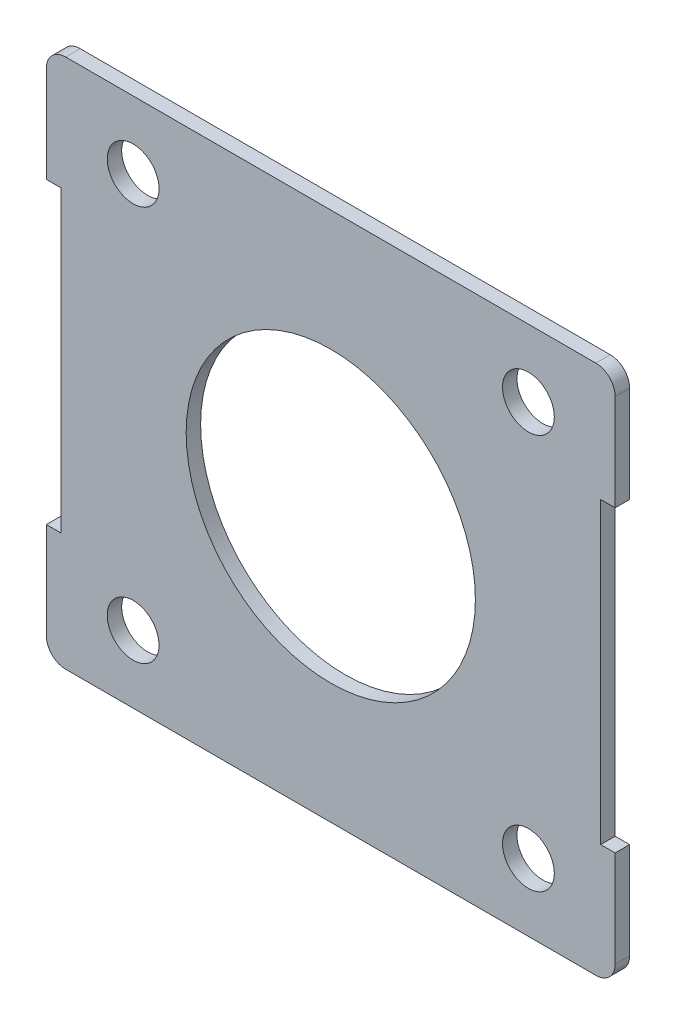
ISO-10303-21;
HEADER;
FILE_DESCRIPTION(('STEP AP214'),'2;1');
FILE_NAME('part.step','',(''),(''),'','','');
FILE_SCHEMA(('AUTOMOTIVE_DESIGN { 1 0 10303 214 1 1 1 1 }'));
ENDSEC;
DATA;
#1=APPLICATION_CONTEXT('core data for automotive mechanical design processes');
#2=APPLICATION_PROTOCOL_DEFINITION('international standard','automotive_design',2000,#1);
#3=PRODUCT_CONTEXT('',#1,'mechanical');
#4=PRODUCT('Part','Part','',(#3));
#5=PRODUCT_RELATED_PRODUCT_CATEGORY('part','',(#4));
#6=PRODUCT_DEFINITION_FORMATION('','',#4);
#7=PRODUCT_DEFINITION_CONTEXT('part definition',#1,'design');
#8=PRODUCT_DEFINITION('design','',#6,#7);
#9=PRODUCT_DEFINITION_SHAPE('','',#8);
#10=(LENGTH_UNIT() NAMED_UNIT(*) SI_UNIT(.MILLI.,.METRE.));
#11=(NAMED_UNIT(*) PLANE_ANGLE_UNIT() SI_UNIT($,.RADIAN.));
#12=(NAMED_UNIT(*) SI_UNIT($,.STERADIAN.) SOLID_ANGLE_UNIT());
#13=UNCERTAINTY_MEASURE_WITH_UNIT(LENGTH_MEASURE(1.E-05),#10,'distance_accuracy_value','');
#14=(GEOMETRIC_REPRESENTATION_CONTEXT(3) GLOBAL_UNCERTAINTY_ASSIGNED_CONTEXT((#13)) GLOBAL_UNIT_ASSIGNED_CONTEXT((#10,
#11,#12)) REPRESENTATION_CONTEXT('',''));
#15=CARTESIAN_POINT('',(0.,0.,0.));
#16=DIRECTION('',(0.,0.,1.));
#17=DIRECTION('',(1.,0.,0.));
#18=AXIS2_PLACEMENT_3D('',#15,#16,#17);
#19=CARTESIAN_POINT('',(93.6625,87.3125,4.7625));
#20=DIRECTION('',(-1.,0.,0.));
#21=DIRECTION('',(0.,-1.,0.));
#22=AXIS2_PLACEMENT_3D('',#19,#20,#21);
#23=PLANE('',#22);
#24=DIRECTION('',(0.,1.,0.));
#25=VECTOR('',#24,1.);
#26=CARTESIAN_POINT('',(93.6625,87.3125,4.7625));
#27=LINE('',#26,#25);
#28=CARTESIAN_POINT('',(93.6624999999999,-80.9625,4.7625));
#29=VERTEX_POINT('',#28);
#30=CARTESIAN_POINT('',(93.6625,-49.2125000000001,4.7625));
#31=VERTEX_POINT('',#30);
#32=EDGE_CURVE('E221',#29,#31,#27,.T.);
#33=ORIENTED_EDGE('',*,*,#32,.F.);
#34=DIRECTION('',(0.,0.,-1.));
#35=VECTOR('',#34,1.);
#36=CARTESIAN_POINT('',(93.6624999999999,-80.9625,4.7625));
#37=LINE('',#36,#35);
#38=CARTESIAN_POINT('',(93.6624999999999,-80.9625,0.));
#39=VERTEX_POINT('',#38);
#40=EDGE_CURVE('E185',#29,#39,#37,.T.);
#41=ORIENTED_EDGE('',*,*,#40,.T.);
#42=DIRECTION('',(0.,1.,0.));
#43=VECTOR('',#42,1.);
#44=CARTESIAN_POINT('',(93.6625,87.3125,0.));
#45=LINE('',#44,#43);
#46=CARTESIAN_POINT('',(93.6625,-49.2125000000001,0.));
#47=VERTEX_POINT('',#46);
#48=EDGE_CURVE('E173',#39,#47,#45,.T.);
#49=ORIENTED_EDGE('',*,*,#48,.T.);
#50=DIRECTION('',(0.,0.,1.));
#51=VECTOR('',#50,1.);
#52=CARTESIAN_POINT('',(93.6625,-49.2125000000001,-0.00100000000000013));
#53=LINE('',#52,#51);
#54=EDGE_CURVE('E157',#47,#31,#53,.T.);
#55=ORIENTED_EDGE('',*,*,#54,.T.);
#56=EDGE_LOOP('',(#33,#41,#49,#55));
#57=FACE_BOUND('',#56,.T.);
#58=ADVANCED_FACE('F31',(#57),#23,.F.);
#59=CARTESIAN_POINT('',(-93.6625,87.3125,4.7625));
#60=DIRECTION('',(1.,0.,0.));
#61=DIRECTION('',(0.,1.,0.));
#62=AXIS2_PLACEMENT_3D('',#59,#60,#61);
#63=PLANE('',#62);
#64=DIRECTION('',(0.,-1.,0.));
#65=VECTOR('',#64,1.);
#66=CARTESIAN_POINT('',(-93.6625,87.3125,4.7625));
#67=LINE('',#66,#65);
#68=CARTESIAN_POINT('',(-93.6625,80.9625,4.7625));
#69=VERTEX_POINT('',#68);
#70=CARTESIAN_POINT('',(-93.6625,49.2125000000001,4.7625));
#71=VERTEX_POINT('',#70);
#72=EDGE_CURVE('E237',#69,#71,#67,.T.);
#73=ORIENTED_EDGE('',*,*,#72,.F.);
#74=DIRECTION('',(0.,0.,-1.));
#75=VECTOR('',#74,1.);
#76=CARTESIAN_POINT('',(-93.6625,80.9625,4.7625));
#77=LINE('',#76,#75);
#78=CARTESIAN_POINT('',(-93.6625,80.9625,0.));
#79=VERTEX_POINT('',#78);
#80=EDGE_CURVE('E11',#69,#79,#77,.T.);
#81=ORIENTED_EDGE('',*,*,#80,.T.);
#82=DIRECTION('',(0.,-1.,0.));
#83=VECTOR('',#82,1.);
#84=CARTESIAN_POINT('',(-93.6625,87.3125,0.));
#85=LINE('',#84,#83);
#86=CARTESIAN_POINT('',(-93.6625,49.2125000000001,0.));
#87=VERTEX_POINT('',#86);
#88=EDGE_CURVE('E178',#79,#87,#85,.T.);
#89=ORIENTED_EDGE('',*,*,#88,.T.);
#90=DIRECTION('',(0.,0.,1.));
#91=VECTOR('',#90,1.);
#92=CARTESIAN_POINT('',(-93.6625,49.2125000000001,-0.00100000000000013));
#93=LINE('',#92,#91);
#94=EDGE_CURVE('E238',#87,#71,#93,.T.);
#95=ORIENTED_EDGE('',*,*,#94,.T.);
#96=EDGE_LOOP('',(#73,#81,#89,#95));
#97=FACE_BOUND('',#96,.T.);
#98=ADVANCED_FACE('F234',(#97),#63,.F.);
#99=CARTESIAN_POINT('',(-93.6624999999999,-49.2125000000001,0.));
#100=VERTEX_POINT('',#99);
#101=CARTESIAN_POINT('',(-93.6624999999999,-80.9625,0.));
#102=VERTEX_POINT('',#101);
#103=EDGE_CURVE('E247',#100,#102,#85,.T.);
#104=ORIENTED_EDGE('',*,*,#103,.T.);
#105=DIRECTION('',(0.,0.,-1.));
#106=VECTOR('',#105,1.);
#107=CARTESIAN_POINT('',(-93.6624999999999,-80.9625,4.7625));
#108=LINE('',#107,#106);
#109=CARTESIAN_POINT('',(-93.6624999999999,-80.9625,4.7625));
#110=VERTEX_POINT('',#109);
#111=EDGE_CURVE('E39',#102,#110,#108,.F.);
#112=ORIENTED_EDGE('',*,*,#111,.T.);
#113=CARTESIAN_POINT('',(-93.6625,-49.2125000000001,4.7625));
#114=VERTEX_POINT('',#113);
#115=EDGE_CURVE('E184',#114,#110,#67,.T.);
#116=ORIENTED_EDGE('',*,*,#115,.F.);
#117=DIRECTION('',(0.,0.,1.));
#118=VECTOR('',#117,1.);
#119=CARTESIAN_POINT('',(-93.6625,-49.2125000000001,-0.00100000000000013));
#120=LINE('',#119,#118);
#121=EDGE_CURVE('E261',#100,#114,#120,.T.);
#122=ORIENTED_EDGE('',*,*,#121,.F.);
#123=EDGE_LOOP('',(#104,#112,#116,#122));
#124=FACE_BOUND('',#123,.T.);
#125=ADVANCED_FACE('F362',(#124),#63,.F.);
#126=CARTESIAN_POINT('',(-93.6624999999999,-87.3125,4.7625));
#127=DIRECTION('',(0.,1.,0.));
#128=DIRECTION('',(-1.,0.,0.));
#129=AXIS2_PLACEMENT_3D('',#126,#127,#128);
#130=PLANE('',#129);
#131=DIRECTION('',(1.,0.,0.));
#132=VECTOR('',#131,1.);
#133=CARTESIAN_POINT('',(-93.6624999999999,-87.3125,0.));
#134=LINE('',#133,#132);
#135=CARTESIAN_POINT('',(-87.3124999999999,-87.3125,0.));
#136=VERTEX_POINT('',#135);
#137=CARTESIAN_POINT('',(87.3124999999999,-87.3125,0.));
#138=VERTEX_POINT('',#137);
#139=EDGE_CURVE('E174',#136,#138,#134,.T.);
#140=ORIENTED_EDGE('',*,*,#139,.T.);
#141=DIRECTION('',(0.,0.,-1.));
#142=VECTOR('',#141,1.);
#143=CARTESIAN_POINT('',(87.3124999999999,-87.3125,4.7625));
#144=LINE('',#143,#142);
#145=CARTESIAN_POINT('',(87.3124999999999,-87.3125,4.7625));
#146=VERTEX_POINT('',#145);
#147=EDGE_CURVE('E199',#138,#146,#144,.F.);
#148=ORIENTED_EDGE('',*,*,#147,.T.);
#149=DIRECTION('',(1.,0.,0.));
#150=VECTOR('',#149,1.);
#151=CARTESIAN_POINT('',(-93.6624999999999,-87.3125,4.7625));
#152=LINE('',#151,#150);
#153=CARTESIAN_POINT('',(-87.3124999999999,-87.3125,4.7625));
#154=VERTEX_POINT('',#153);
#155=EDGE_CURVE('E222',#154,#146,#152,.T.);
#156=ORIENTED_EDGE('',*,*,#155,.F.);
#157=DIRECTION('',(0.,0.,-1.));
#158=VECTOR('',#157,1.);
#159=CARTESIAN_POINT('',(-87.3124999999999,-87.3125,4.7625));
#160=LINE('',#159,#158);
#161=EDGE_CURVE('E196',#154,#136,#160,.T.);
#162=ORIENTED_EDGE('',*,*,#161,.T.);
#163=EDGE_LOOP('',(#140,#148,#156,#162));
#164=FACE_BOUND('',#163,.T.);
#165=ADVANCED_FACE('F367',(#164),#130,.F.);
#166=CARTESIAN_POINT('',(93.6625,49.2125000000001,0.));
#167=VERTEX_POINT('',#166);
#168=CARTESIAN_POINT('',(93.6625,80.9625,0.));
#169=VERTEX_POINT('',#168);
#170=EDGE_CURVE('E163',#167,#169,#45,.T.);
#171=ORIENTED_EDGE('',*,*,#170,.T.);
#172=DIRECTION('',(0.,0.,-1.));
#173=VECTOR('',#172,1.);
#174=CARTESIAN_POINT('',(93.6625,80.9625,4.7625));
#175=LINE('',#174,#173);
#176=CARTESIAN_POINT('',(93.6625,80.9625,4.7625));
#177=VERTEX_POINT('',#176);
#178=EDGE_CURVE('E213',#169,#177,#175,.F.);
#179=ORIENTED_EDGE('',*,*,#178,.T.);
#180=CARTESIAN_POINT('',(93.6624999999999,49.2125000000001,4.7625));
#181=VERTEX_POINT('',#180);
#182=EDGE_CURVE('E166',#181,#177,#27,.T.);
#183=ORIENTED_EDGE('',*,*,#182,.F.);
#184=DIRECTION('',(0.,0.,1.));
#185=VECTOR('',#184,1.);
#186=CARTESIAN_POINT('',(93.6624999999999,49.2125000000001,-0.00100000000000013));
#187=LINE('',#186,#185);
#188=EDGE_CURVE('E150',#167,#181,#187,.T.);
#189=ORIENTED_EDGE('',*,*,#188,.F.);
#190=EDGE_LOOP('',(#171,#179,#183,#189));
#191=FACE_BOUND('',#190,.T.);
#192=ADVANCED_FACE('F162',(#191),#23,.F.);
#193=CARTESIAN_POINT('',(-93.6625,87.3125,4.7625));
#194=DIRECTION('',(0.,-1.,0.));
#195=DIRECTION('',(0.,0.,-1.));
#196=AXIS2_PLACEMENT_3D('',#193,#194,#195);
#197=PLANE('',#196);
#198=DIRECTION('',(-1.,0.,0.));
#199=VECTOR('',#198,1.);
#200=CARTESIAN_POINT('',(-93.6625,87.3125,4.7625));
#201=LINE('',#200,#199);
#202=CARTESIAN_POINT('',(87.3125,87.3125,4.7625));
#203=VERTEX_POINT('',#202);
#204=CARTESIAN_POINT('',(-87.3125,87.3125,4.7625));
#205=VERTEX_POINT('',#204);
#206=EDGE_CURVE('E189',#203,#205,#201,.T.);
#207=ORIENTED_EDGE('',*,*,#206,.F.);
#208=DIRECTION('',(0.,0.,-1.));
#209=VECTOR('',#208,1.);
#210=CARTESIAN_POINT('',(87.3125,87.3125,4.7625));
#211=LINE('',#210,#209);
#212=CARTESIAN_POINT('',(87.3125,87.3125,0.));
#213=VERTEX_POINT('',#212);
#214=EDGE_CURVE('E210',#203,#213,#211,.T.);
#215=ORIENTED_EDGE('',*,*,#214,.T.);
#216=DIRECTION('',(-1.,0.,0.));
#217=VECTOR('',#216,1.);
#218=CARTESIAN_POINT('',(-93.6625,87.3125,0.));
#219=LINE('',#218,#217);
#220=CARTESIAN_POINT('',(-87.3125,87.3125,0.));
#221=VERTEX_POINT('',#220);
#222=EDGE_CURVE('E176',#213,#221,#219,.T.);
#223=ORIENTED_EDGE('',*,*,#222,.T.);
#224=DIRECTION('',(0.,0.,-1.));
#225=VECTOR('',#224,1.);
#226=CARTESIAN_POINT('',(-87.3125,87.3125,4.7625));
#227=LINE('',#226,#225);
#228=EDGE_CURVE('E208',#221,#205,#227,.F.);
#229=ORIENTED_EDGE('',*,*,#228,.T.);
#230=EDGE_LOOP('',(#207,#215,#223,#229));
#231=FACE_BOUND('',#230,.T.);
#232=ADVANCED_FACE('F227',(#231),#197,.F.);
#233=CARTESIAN_POINT('',(-93.6625,87.3125,4.7625));
#234=DIRECTION('',(0.,0.,1.));
#235=DIRECTION('',(1.,0.,0.));
#236=AXIS2_PLACEMENT_3D('',#233,#234,#235);
#237=PLANE('',#236);
#238=CARTESIAN_POINT('',(65.0874999999995,65.0875000000004,4.7625));
#239=DIRECTION('',(0.,0.,1.));
#240=DIRECTION('',(1.,0.,0.));
#241=AXIS2_PLACEMENT_3D('',#238,#239,#240);
#242=CIRCLE('',#241,8.5328125);
#243=CARTESIAN_POINT('',(73.6203124999995,65.0875000000004,4.7625));
#244=VERTEX_POINT('',#243);
#245=EDGE_CURVE('E319',#244,#244,#242,.T.);
#246=ORIENTED_EDGE('',*,*,#245,.F.);
#247=EDGE_LOOP('',(#246));
#248=FACE_BOUND('',#247,.T.);
#249=CARTESIAN_POINT('',(65.0875000000002,-65.0874999999998,4.7625));
#250=DIRECTION('',(0.,0.,1.));
#251=DIRECTION('',(1.,0.,0.));
#252=AXIS2_PLACEMENT_3D('',#249,#250,#251);
#253=CIRCLE('',#252,8.5328125);
#254=CARTESIAN_POINT('',(73.6203125000002,-65.0874999999998,4.7625));
#255=VERTEX_POINT('',#254);
#256=EDGE_CURVE('E313',#255,#255,#253,.T.);
#257=ORIENTED_EDGE('',*,*,#256,.F.);
#258=EDGE_LOOP('',(#257));
#259=FACE_BOUND('',#258,.T.);
#260=CARTESIAN_POINT('',(-65.0875,-65.0875,4.7625));
#261=DIRECTION('',(0.,0.,1.));
#262=DIRECTION('',(1.,0.,0.));
#263=AXIS2_PLACEMENT_3D('',#260,#261,#262);
#264=CIRCLE('',#263,8.5328125);
#265=CARTESIAN_POINT('',(-56.5546875,-65.0875,4.7625));
#266=VERTEX_POINT('',#265);
#267=EDGE_CURVE('E307',#266,#266,#264,.T.);
#268=ORIENTED_EDGE('',*,*,#267,.F.);
#269=EDGE_LOOP('',(#268));
#270=FACE_BOUND('',#269,.T.);
#271=CARTESIAN_POINT('',(-65.0875000000007,65.0874999999993,4.7625));
#272=DIRECTION('',(0.,0.,1.));
#273=DIRECTION('',(1.,0.,0.));
#274=AXIS2_PLACEMENT_3D('',#271,#272,#273);
#275=CIRCLE('',#274,8.5328125);
#276=CARTESIAN_POINT('',(-56.5546875000007,65.0874999999993,4.7625));
#277=VERTEX_POINT('',#276);
#278=EDGE_CURVE('E301',#277,#277,#275,.T.);
#279=ORIENTED_EDGE('',*,*,#278,.F.);
#280=EDGE_LOOP('',(#279));
#281=FACE_BOUND('',#280,.T.);
#282=CARTESIAN_POINT('',(0.,0.,4.7625));
#283=DIRECTION('',(0.,0.,1.));
#284=DIRECTION('',(1.,0.,0.));
#285=AXIS2_PLACEMENT_3D('',#282,#283,#284);
#286=CIRCLE('',#285,47.625);
#287=CARTESIAN_POINT('',(47.625,0.,4.7625));
#288=VERTEX_POINT('',#287);
#289=EDGE_CURVE('E295',#288,#288,#286,.T.);
#290=ORIENTED_EDGE('',*,*,#289,.F.);
#291=EDGE_LOOP('',(#290));
#292=FACE_BOUND('',#291,.T.);
#293=ORIENTED_EDGE('',*,*,#155,.T.);
#294=CARTESIAN_POINT('',(87.3124999999999,-80.9625,4.7625));
#295=DIRECTION('',(0.,0.,1.));
#296=DIRECTION('',(1.,0.,0.));
#297=AXIS2_PLACEMENT_3D('',#294,#295,#296);
#298=CIRCLE('',#297,6.35);
#299=EDGE_CURVE('E206',#146,#29,#298,.T.);
#300=ORIENTED_EDGE('',*,*,#299,.T.);
#301=ORIENTED_EDGE('',*,*,#32,.T.);
#302=DIRECTION('',(1.,0.,0.));
#303=VECTOR('',#302,1.);
#304=CARTESIAN_POINT('',(93.6625,-49.2125000000001,4.7625));
#305=LINE('',#304,#303);
#306=CARTESIAN_POINT('',(88.9000000000001,-49.2125000000001,4.7625));
#307=VERTEX_POINT('',#306);
#308=EDGE_CURVE('E167',#307,#31,#305,.T.);
#309=ORIENTED_EDGE('',*,*,#308,.F.);
#310=DIRECTION('',(0.,-1.,0.));
#311=VECTOR('',#310,1.);
#312=CARTESIAN_POINT('',(88.9000000000001,49.2125000000001,4.7625));
#313=LINE('',#312,#311);
#314=CARTESIAN_POINT('',(88.9000000000001,49.2125000000001,4.7625));
#315=VERTEX_POINT('',#314);
#316=EDGE_CURVE('E283',#315,#307,#313,.T.);
#317=ORIENTED_EDGE('',*,*,#316,.F.);
#318=DIRECTION('',(-1.,0.,0.));
#319=VECTOR('',#318,1.);
#320=CARTESIAN_POINT('',(93.6624999999999,49.2125000000001,4.7625));
#321=LINE('',#320,#319);
#322=EDGE_CURVE('E220',#181,#315,#321,.T.);
#323=ORIENTED_EDGE('',*,*,#322,.F.);
#324=ORIENTED_EDGE('',*,*,#182,.T.);
#325=CARTESIAN_POINT('',(87.3125,80.9625,4.7625));
#326=DIRECTION('',(0.,0.,1.));
#327=DIRECTION('',(1.,0.,0.));
#328=AXIS2_PLACEMENT_3D('',#325,#326,#327);
#329=CIRCLE('',#328,6.35);
#330=EDGE_CURVE('E204',#177,#203,#329,.T.);
#331=ORIENTED_EDGE('',*,*,#330,.T.);
#332=ORIENTED_EDGE('',*,*,#206,.T.);
#333=CARTESIAN_POINT('',(-87.3125,80.9625,4.7625));
#334=DIRECTION('',(0.,0.,1.));
#335=DIRECTION('',(1.,0.,0.));
#336=AXIS2_PLACEMENT_3D('',#333,#334,#335);
#337=CIRCLE('',#336,6.35);
#338=EDGE_CURVE('E53',#205,#69,#337,.T.);
#339=ORIENTED_EDGE('',*,*,#338,.T.);
#340=ORIENTED_EDGE('',*,*,#72,.T.);
#341=DIRECTION('',(-1.,0.,0.));
#342=VECTOR('',#341,1.);
#343=CARTESIAN_POINT('',(-93.6625,49.2125000000001,4.7625));
#344=LINE('',#343,#342);
#345=CARTESIAN_POINT('',(-88.9000000000001,49.2125000000001,4.7625));
#346=VERTEX_POINT('',#345);
#347=EDGE_CURVE('E258',#346,#71,#344,.T.);
#348=ORIENTED_EDGE('',*,*,#347,.F.);
#349=DIRECTION('',(0.,1.,0.));
#350=VECTOR('',#349,1.);
#351=CARTESIAN_POINT('',(-88.9000000000001,49.2125000000001,4.7625));
#352=LINE('',#351,#350);
#353=CARTESIAN_POINT('',(-88.9000000000001,-49.2125000000001,4.7625));
#354=VERTEX_POINT('',#353);
#355=EDGE_CURVE('E264',#354,#346,#352,.T.);
#356=ORIENTED_EDGE('',*,*,#355,.F.);
#357=DIRECTION('',(1.,0.,0.));
#358=VECTOR('',#357,1.);
#359=CARTESIAN_POINT('',(-93.6625,-49.2125000000001,4.7625));
#360=LINE('',#359,#358);
#361=EDGE_CURVE('E267',#114,#354,#360,.T.);
#362=ORIENTED_EDGE('',*,*,#361,.F.);
#363=ORIENTED_EDGE('',*,*,#115,.T.);
#364=CARTESIAN_POINT('',(-87.3124999999999,-80.9625,4.7625));
#365=DIRECTION('',(0.,0.,1.));
#366=DIRECTION('',(1.,0.,0.));
#367=AXIS2_PLACEMENT_3D('',#364,#365,#366);
#368=CIRCLE('',#367,6.35);
#369=EDGE_CURVE('E202',#110,#154,#368,.T.);
#370=ORIENTED_EDGE('',*,*,#369,.T.);
#371=EDGE_LOOP('',(#293,#300,#301,#309,#317,#323,#324,#331,#332,#339,#340,#348,#356,#362,#363,#370));
#372=FACE_BOUND('',#371,.T.);
#373=ADVANCED_FACE('F217',(#248,#259,#270,#281,#292,#372),#237,.T.);
#374=CARTESIAN_POINT('',(-93.6625,87.3125,0.));
#375=DIRECTION('',(0.,0.,1.));
#376=DIRECTION('',(1.,0.,0.));
#377=AXIS2_PLACEMENT_3D('',#374,#375,#376);
#378=PLANE('',#377);
#379=CARTESIAN_POINT('',(65.0874999999995,65.0875000000004,0.));
#380=DIRECTION('',(0.,0.,1.));
#381=DIRECTION('',(1.,0.,0.));
#382=AXIS2_PLACEMENT_3D('',#379,#380,#381);
#383=CIRCLE('',#382,8.5328125);
#384=CARTESIAN_POINT('',(73.6203124999995,65.0875000000004,0.));
#385=VERTEX_POINT('',#384);
#386=EDGE_CURVE('E316',#385,#385,#383,.F.);
#387=ORIENTED_EDGE('',*,*,#386,.F.);
#388=EDGE_LOOP('',(#387));
#389=FACE_BOUND('',#388,.T.);
#390=CARTESIAN_POINT('',(65.0875000000002,-65.0874999999998,0.));
#391=DIRECTION('',(0.,0.,1.));
#392=DIRECTION('',(1.,0.,0.));
#393=AXIS2_PLACEMENT_3D('',#390,#391,#392);
#394=CIRCLE('',#393,8.5328125);
#395=CARTESIAN_POINT('',(73.6203125000002,-65.0874999999998,0.));
#396=VERTEX_POINT('',#395);
#397=EDGE_CURVE('E310',#396,#396,#394,.F.);
#398=ORIENTED_EDGE('',*,*,#397,.F.);
#399=EDGE_LOOP('',(#398));
#400=FACE_BOUND('',#399,.T.);
#401=CARTESIAN_POINT('',(-65.0875,-65.0875,0.));
#402=DIRECTION('',(0.,0.,1.));
#403=DIRECTION('',(1.,0.,0.));
#404=AXIS2_PLACEMENT_3D('',#401,#402,#403);
#405=CIRCLE('',#404,8.5328125);
#406=CARTESIAN_POINT('',(-56.5546875,-65.0875,0.));
#407=VERTEX_POINT('',#406);
#408=EDGE_CURVE('E304',#407,#407,#405,.F.);
#409=ORIENTED_EDGE('',*,*,#408,.F.);
#410=EDGE_LOOP('',(#409));
#411=FACE_BOUND('',#410,.T.);
#412=CARTESIAN_POINT('',(-65.0875000000007,65.0874999999993,0.));
#413=DIRECTION('',(0.,0.,1.));
#414=DIRECTION('',(1.,0.,0.));
#415=AXIS2_PLACEMENT_3D('',#412,#413,#414);
#416=CIRCLE('',#415,8.5328125);
#417=CARTESIAN_POINT('',(-56.5546875000007,65.0874999999993,0.));
#418=VERTEX_POINT('',#417);
#419=EDGE_CURVE('E298',#418,#418,#416,.F.);
#420=ORIENTED_EDGE('',*,*,#419,.F.);
#421=EDGE_LOOP('',(#420));
#422=FACE_BOUND('',#421,.T.);
#423=CARTESIAN_POINT('',(0.,0.,0.));
#424=DIRECTION('',(0.,0.,1.));
#425=DIRECTION('',(1.,0.,0.));
#426=AXIS2_PLACEMENT_3D('',#423,#424,#425);
#427=CIRCLE('',#426,47.625);
#428=CARTESIAN_POINT('',(47.625,0.,0.));
#429=VERTEX_POINT('',#428);
#430=EDGE_CURVE('E292',#429,#429,#427,.F.);
#431=ORIENTED_EDGE('',*,*,#430,.F.);
#432=EDGE_LOOP('',(#431));
#433=FACE_BOUND('',#432,.T.);
#434=ORIENTED_EDGE('',*,*,#48,.F.);
#435=CARTESIAN_POINT('',(87.3124999999999,-80.9625,0.));
#436=DIRECTION('',(0.,0.,1.));
#437=DIRECTION('',(1.,0.,0.));
#438=AXIS2_PLACEMENT_3D('',#435,#436,#437);
#439=CIRCLE('',#438,6.35);
#440=EDGE_CURVE('E194',#39,#138,#439,.F.);
#441=ORIENTED_EDGE('',*,*,#440,.T.);
#442=ORIENTED_EDGE('',*,*,#139,.F.);
#443=CARTESIAN_POINT('',(-87.3124999999999,-80.9625,0.));
#444=DIRECTION('',(0.,0.,1.));
#445=DIRECTION('',(1.,0.,0.));
#446=AXIS2_PLACEMENT_3D('',#443,#444,#445);
#447=CIRCLE('',#446,6.35);
#448=EDGE_CURVE('E191',#136,#102,#447,.F.);
#449=ORIENTED_EDGE('',*,*,#448,.T.);
#450=ORIENTED_EDGE('',*,*,#103,.F.);
#451=DIRECTION('',(-1.,0.,0.));
#452=VECTOR('',#451,1.);
#453=CARTESIAN_POINT('',(-93.6625,-49.2125000000001,0.));
#454=LINE('',#453,#452);
#455=CARTESIAN_POINT('',(-88.9000000000001,-49.2125000000001,0.));
#456=VERTEX_POINT('',#455);
#457=EDGE_CURVE('E244',#456,#100,#454,.T.);
#458=ORIENTED_EDGE('',*,*,#457,.F.);
#459=DIRECTION('',(0.,-1.,0.));
#460=VECTOR('',#459,1.);
#461=CARTESIAN_POINT('',(-88.9000000000001,49.2125000000001,0.));
#462=LINE('',#461,#460);
#463=CARTESIAN_POINT('',(-88.9000000000001,49.2125000000001,0.));
#464=VERTEX_POINT('',#463);
#465=EDGE_CURVE('E156',#464,#456,#462,.T.);
#466=ORIENTED_EDGE('',*,*,#465,.F.);
#467=DIRECTION('',(1.,0.,0.));
#468=VECTOR('',#467,1.);
#469=CARTESIAN_POINT('',(-93.6625,49.2125000000001,0.));
#470=LINE('',#469,#468);
#471=EDGE_CURVE('E270',#87,#464,#470,.T.);
#472=ORIENTED_EDGE('',*,*,#471,.F.);
#473=ORIENTED_EDGE('',*,*,#88,.F.);
#474=CARTESIAN_POINT('',(-87.3125,80.9625,0.));
#475=DIRECTION('',(0.,0.,1.));
#476=DIRECTION('',(1.,0.,0.));
#477=AXIS2_PLACEMENT_3D('',#474,#475,#476);
#478=CIRCLE('',#477,6.35);
#479=EDGE_CURVE('E188',#79,#221,#478,.F.);
#480=ORIENTED_EDGE('',*,*,#479,.T.);
#481=ORIENTED_EDGE('',*,*,#222,.F.);
#482=CARTESIAN_POINT('',(87.3125,80.9625,0.));
#483=DIRECTION('',(0.,0.,1.));
#484=DIRECTION('',(1.,0.,0.));
#485=AXIS2_PLACEMENT_3D('',#482,#483,#484);
#486=CIRCLE('',#485,6.35);
#487=EDGE_CURVE('E172',#213,#169,#486,.F.);
#488=ORIENTED_EDGE('',*,*,#487,.T.);
#489=ORIENTED_EDGE('',*,*,#170,.F.);
#490=DIRECTION('',(1.,0.,0.));
#491=VECTOR('',#490,1.);
#492=CARTESIAN_POINT('',(93.6624999999999,49.2125000000001,0.));
#493=LINE('',#492,#491);
#494=CARTESIAN_POINT('',(88.9000000000001,49.2125000000001,0.));
#495=VERTEX_POINT('',#494);
#496=EDGE_CURVE('E146',#495,#167,#493,.T.);
#497=ORIENTED_EDGE('',*,*,#496,.F.);
#498=DIRECTION('',(0.,1.,0.));
#499=VECTOR('',#498,1.);
#500=CARTESIAN_POINT('',(88.9000000000001,49.2125000000001,0.));
#501=LINE('',#500,#499);
#502=CARTESIAN_POINT('',(88.9000000000001,-49.2125000000001,0.));
#503=VERTEX_POINT('',#502);
#504=EDGE_CURVE('E290',#503,#495,#501,.T.);
#505=ORIENTED_EDGE('',*,*,#504,.F.);
#506=DIRECTION('',(-1.,0.,0.));
#507=VECTOR('',#506,1.);
#508=CARTESIAN_POINT('',(93.6625,-49.2125000000001,0.));
#509=LINE('',#508,#507);
#510=EDGE_CURVE('E287',#47,#503,#509,.T.);
#511=ORIENTED_EDGE('',*,*,#510,.F.);
#512=EDGE_LOOP('',(#434,#441,#442,#449,#450,#458,#466,#472,#473,#480,#481,#488,#489,#497,#505,#511));
#513=FACE_BOUND('',#512,.T.);
#514=ADVANCED_FACE('F170',(#389,#400,#411,#422,#433,#513),#378,.F.);
#515=CARTESIAN_POINT('',(-93.6625,49.2125000000001,-0.00100000000000013));
#516=DIRECTION('',(0.,1.,0.));
#517=DIRECTION('',(0.,0.,1.));
#518=AXIS2_PLACEMENT_3D('',#515,#516,#517);
#519=PLANE('',#518);
#520=ORIENTED_EDGE('',*,*,#471,.T.);
#521=DIRECTION('',(0.,0.,1.));
#522=VECTOR('',#521,1.);
#523=CARTESIAN_POINT('',(-88.9000000000001,49.2125000000001,-0.00100000000000013));
#524=LINE('',#523,#522);
#525=EDGE_CURVE('E253',#464,#346,#524,.T.);
#526=ORIENTED_EDGE('',*,*,#525,.T.);
#527=ORIENTED_EDGE('',*,*,#347,.T.);
#528=ORIENTED_EDGE('',*,*,#94,.F.);
#529=EDGE_LOOP('',(#520,#526,#527,#528));
#530=FACE_BOUND('',#529,.T.);
#531=ADVANCED_FACE('F345',(#530),#519,.F.);
#532=CARTESIAN_POINT('',(-88.9000000000001,49.2125000000001,-0.00100000000000013));
#533=DIRECTION('',(1.,0.,0.));
#534=DIRECTION('',(0.,1.,0.));
#535=AXIS2_PLACEMENT_3D('',#532,#533,#534);
#536=PLANE('',#535);
#537=ORIENTED_EDGE('',*,*,#465,.T.);
#538=DIRECTION('',(0.,0.,1.));
#539=VECTOR('',#538,1.);
#540=CARTESIAN_POINT('',(-88.9000000000001,-49.2125000000001,-0.00100000000000013));
#541=LINE('',#540,#539);
#542=EDGE_CURVE('E255',#456,#354,#541,.T.);
#543=ORIENTED_EDGE('',*,*,#542,.T.);
#544=ORIENTED_EDGE('',*,*,#355,.T.);
#545=ORIENTED_EDGE('',*,*,#525,.F.);
#546=EDGE_LOOP('',(#537,#543,#544,#545));
#547=FACE_BOUND('',#546,.T.);
#548=ADVANCED_FACE('F351',(#547),#536,.F.);
#549=CARTESIAN_POINT('',(-93.6625,-49.2125000000001,-0.00100000000000013));
#550=DIRECTION('',(0.,-1.,0.));
#551=DIRECTION('',(0.,0.,-1.));
#552=AXIS2_PLACEMENT_3D('',#549,#550,#551);
#553=PLANE('',#552);
#554=ORIENTED_EDGE('',*,*,#457,.T.);
#555=ORIENTED_EDGE('',*,*,#121,.T.);
#556=ORIENTED_EDGE('',*,*,#361,.T.);
#557=ORIENTED_EDGE('',*,*,#542,.F.);
#558=EDGE_LOOP('',(#554,#555,#556,#557));
#559=FACE_BOUND('',#558,.T.);
#560=ADVANCED_FACE('F409',(#559),#553,.F.);
#561=CARTESIAN_POINT('',(93.6625,-49.2125000000001,-0.00100000000000013));
#562=DIRECTION('',(0.,-1.,0.));
#563=DIRECTION('',(1.,0.,0.));
#564=AXIS2_PLACEMENT_3D('',#561,#562,#563);
#565=PLANE('',#564);
#566=ORIENTED_EDGE('',*,*,#510,.T.);
#567=DIRECTION('',(0.,0.,1.));
#568=VECTOR('',#567,1.);
#569=CARTESIAN_POINT('',(88.9000000000001,-49.2125000000001,-0.00100000000000013));
#570=LINE('',#569,#568);
#571=EDGE_CURVE('E277',#503,#307,#570,.T.);
#572=ORIENTED_EDGE('',*,*,#571,.T.);
#573=ORIENTED_EDGE('',*,*,#308,.T.);
#574=ORIENTED_EDGE('',*,*,#54,.F.);
#575=EDGE_LOOP('',(#566,#572,#573,#574));
#576=FACE_BOUND('',#575,.T.);
#577=ADVANCED_FACE('F399',(#576),#565,.F.);
#578=CARTESIAN_POINT('',(88.9000000000001,49.2125000000001,-0.00100000000000013));
#579=DIRECTION('',(-1.,0.,0.));
#580=DIRECTION('',(0.,-1.,0.));
#581=AXIS2_PLACEMENT_3D('',#578,#579,#580);
#582=PLANE('',#581);
#583=ORIENTED_EDGE('',*,*,#504,.T.);
#584=DIRECTION('',(0.,0.,1.));
#585=VECTOR('',#584,1.);
#586=CARTESIAN_POINT('',(88.9000000000001,49.2125000000001,-0.00100000000000013));
#587=LINE('',#586,#585);
#588=EDGE_CURVE('E152',#495,#315,#587,.T.);
#589=ORIENTED_EDGE('',*,*,#588,.T.);
#590=ORIENTED_EDGE('',*,*,#316,.T.);
#591=ORIENTED_EDGE('',*,*,#571,.F.);
#592=EDGE_LOOP('',(#583,#589,#590,#591));
#593=FACE_BOUND('',#592,.T.);
#594=ADVANCED_FACE('F401',(#593),#582,.F.);
#595=CARTESIAN_POINT('',(93.6624999999999,49.2125000000001,-0.00100000000000013));
#596=DIRECTION('',(0.,1.,0.));
#597=DIRECTION('',(0.,0.,1.));
#598=AXIS2_PLACEMENT_3D('',#595,#596,#597);
#599=PLANE('',#598);
#600=ORIENTED_EDGE('',*,*,#496,.T.);
#601=ORIENTED_EDGE('',*,*,#188,.T.);
#602=ORIENTED_EDGE('',*,*,#322,.T.);
#603=ORIENTED_EDGE('',*,*,#588,.F.);
#604=EDGE_LOOP('',(#600,#601,#602,#603));
#605=FACE_BOUND('',#604,.T.);
#606=ADVANCED_FACE('F148',(#605),#599,.F.);
#607=CARTESIAN_POINT('',(87.3124999999999,-80.9625,4.7625));
#608=DIRECTION('',(0.,0.,-1.));
#609=DIRECTION('',(-1.,0.,0.));
#610=AXIS2_PLACEMENT_3D('',#607,#608,#609);
#611=CYLINDRICAL_SURFACE('',#610,6.35);
#612=ORIENTED_EDGE('',*,*,#299,.F.);
#613=ORIENTED_EDGE('',*,*,#147,.F.);
#614=ORIENTED_EDGE('',*,*,#440,.F.);
#615=ORIENTED_EDGE('',*,*,#40,.F.);
#616=EDGE_LOOP('',(#612,#613,#614,#615));
#617=FACE_BOUND('',#616,.T.);
#618=ADVANCED_FACE('F377',(#617),#611,.T.);
#619=CARTESIAN_POINT('',(87.3125,80.9625,4.7625));
#620=DIRECTION('',(0.,0.,-1.));
#621=DIRECTION('',(-1.,0.,0.));
#622=AXIS2_PLACEMENT_3D('',#619,#620,#621);
#623=CYLINDRICAL_SURFACE('',#622,6.35);
#624=ORIENTED_EDGE('',*,*,#330,.F.);
#625=ORIENTED_EDGE('',*,*,#178,.F.);
#626=ORIENTED_EDGE('',*,*,#487,.F.);
#627=ORIENTED_EDGE('',*,*,#214,.F.);
#628=EDGE_LOOP('',(#624,#625,#626,#627));
#629=FACE_BOUND('',#628,.T.);
#630=ADVANCED_FACE('F225',(#629),#623,.T.);
#631=CARTESIAN_POINT('',(-87.3124999999999,-80.9625,4.7625));
#632=DIRECTION('',(0.,0.,-1.));
#633=DIRECTION('',(-1.,0.,0.));
#634=AXIS2_PLACEMENT_3D('',#631,#632,#633);
#635=CYLINDRICAL_SURFACE('',#634,6.35);
#636=ORIENTED_EDGE('',*,*,#369,.F.);
#637=ORIENTED_EDGE('',*,*,#111,.F.);
#638=ORIENTED_EDGE('',*,*,#448,.F.);
#639=ORIENTED_EDGE('',*,*,#161,.F.);
#640=EDGE_LOOP('',(#636,#637,#638,#639));
#641=FACE_BOUND('',#640,.T.);
#642=ADVANCED_FACE('F382',(#641),#635,.T.);
#643=CARTESIAN_POINT('',(-87.3125,80.9625,4.7625));
#644=DIRECTION('',(0.,0.,-1.));
#645=DIRECTION('',(-1.,0.,0.));
#646=AXIS2_PLACEMENT_3D('',#643,#644,#645);
#647=CYLINDRICAL_SURFACE('',#646,6.35);
#648=ORIENTED_EDGE('',*,*,#338,.F.);
#649=ORIENTED_EDGE('',*,*,#228,.F.);
#650=ORIENTED_EDGE('',*,*,#479,.F.);
#651=ORIENTED_EDGE('',*,*,#80,.F.);
#652=EDGE_LOOP('',(#648,#649,#650,#651));
#653=FACE_BOUND('',#652,.T.);
#654=ADVANCED_FACE('F33',(#653),#647,.T.);
#655=CARTESIAN_POINT('',(0.,0.,-0.00100000000000013));
#656=DIRECTION('',(0.,0.,1.));
#657=DIRECTION('',(1.,0.,0.));
#658=AXIS2_PLACEMENT_3D('',#655,#656,#657);
#659=CYLINDRICAL_SURFACE('',#658,47.625);
#660=ORIENTED_EDGE('',*,*,#289,.T.);
#661=EDGE_LOOP('',(#660));
#662=FACE_BOUND('',#661,.T.);
#663=ORIENTED_EDGE('',*,*,#430,.T.);
#664=EDGE_LOOP('',(#663));
#665=FACE_BOUND('',#664,.T.);
#666=ADVANCED_FACE('F337',(#662,#665),#659,.F.);
#667=CARTESIAN_POINT('',(-65.0875000000007,65.0874999999993,-0.00100000000000013));
#668=DIRECTION('',(0.,0.,1.));
#669=DIRECTION('',(1.,0.,0.));
#670=AXIS2_PLACEMENT_3D('',#667,#668,#669);
#671=CYLINDRICAL_SURFACE('',#670,8.5328125);
#672=ORIENTED_EDGE('',*,*,#278,.T.);
#673=EDGE_LOOP('',(#672));
#674=FACE_BOUND('',#673,.T.);
#675=ORIENTED_EDGE('',*,*,#419,.T.);
#676=EDGE_LOOP('',(#675));
#677=FACE_BOUND('',#676,.T.);
#678=ADVANCED_FACE('F340',(#674,#677),#671,.F.);
#679=CARTESIAN_POINT('',(-65.0875,-65.0875,-0.00100000000000013));
#680=DIRECTION('',(0.,0.,1.));
#681=DIRECTION('',(1.,0.,0.));
#682=AXIS2_PLACEMENT_3D('',#679,#680,#681);
#683=CYLINDRICAL_SURFACE('',#682,8.5328125);
#684=ORIENTED_EDGE('',*,*,#267,.T.);
#685=EDGE_LOOP('',(#684));
#686=FACE_BOUND('',#685,.T.);
#687=ORIENTED_EDGE('',*,*,#408,.T.);
#688=EDGE_LOOP('',(#687));
#689=FACE_BOUND('',#688,.T.);
#690=ADVANCED_FACE('F511',(#686,#689),#683,.F.);
#691=CARTESIAN_POINT('',(65.0875000000002,-65.0874999999998,-0.00100000000000013));
#692=DIRECTION('',(0.,0.,1.));
#693=DIRECTION('',(1.,0.,0.));
#694=AXIS2_PLACEMENT_3D('',#691,#692,#693);
#695=CYLINDRICAL_SURFACE('',#694,8.5328125);
#696=ORIENTED_EDGE('',*,*,#256,.T.);
#697=EDGE_LOOP('',(#696));
#698=FACE_BOUND('',#697,.T.);
#699=ORIENTED_EDGE('',*,*,#397,.T.);
#700=EDGE_LOOP('',(#699));
#701=FACE_BOUND('',#700,.T.);
#702=ADVANCED_FACE('F521',(#698,#701),#695,.F.);
#703=CARTESIAN_POINT('',(65.0874999999995,65.0875000000004,-0.00100000000000013));
#704=DIRECTION('',(0.,0.,1.));
#705=DIRECTION('',(1.,0.,0.));
#706=AXIS2_PLACEMENT_3D('',#703,#704,#705);
#707=CYLINDRICAL_SURFACE('',#706,8.5328125);
#708=ORIENTED_EDGE('',*,*,#245,.T.);
#709=EDGE_LOOP('',(#708));
#710=FACE_BOUND('',#709,.T.);
#711=ORIENTED_EDGE('',*,*,#386,.T.);
#712=EDGE_LOOP('',(#711));
#713=FACE_BOUND('',#712,.T.);
#714=ADVANCED_FACE('F323',(#710,#713),#707,.F.);
#715=CLOSED_SHELL('',(#58,#98,#125,#165,#192,#232,#373,#514,#531,#548,#560,#577,#594,#606,#618,
#630,#642,#654,#666,#678,#690,#702,#714));
#716=MANIFOLD_SOLID_BREP('B2',#715);
#717=ADVANCED_BREP_SHAPE_REPRESENTATION('',(#18,#716),#14);
#718=SHAPE_DEFINITION_REPRESENTATION(#9,#717);
ENDSEC;
END-ISO-10303-21;
